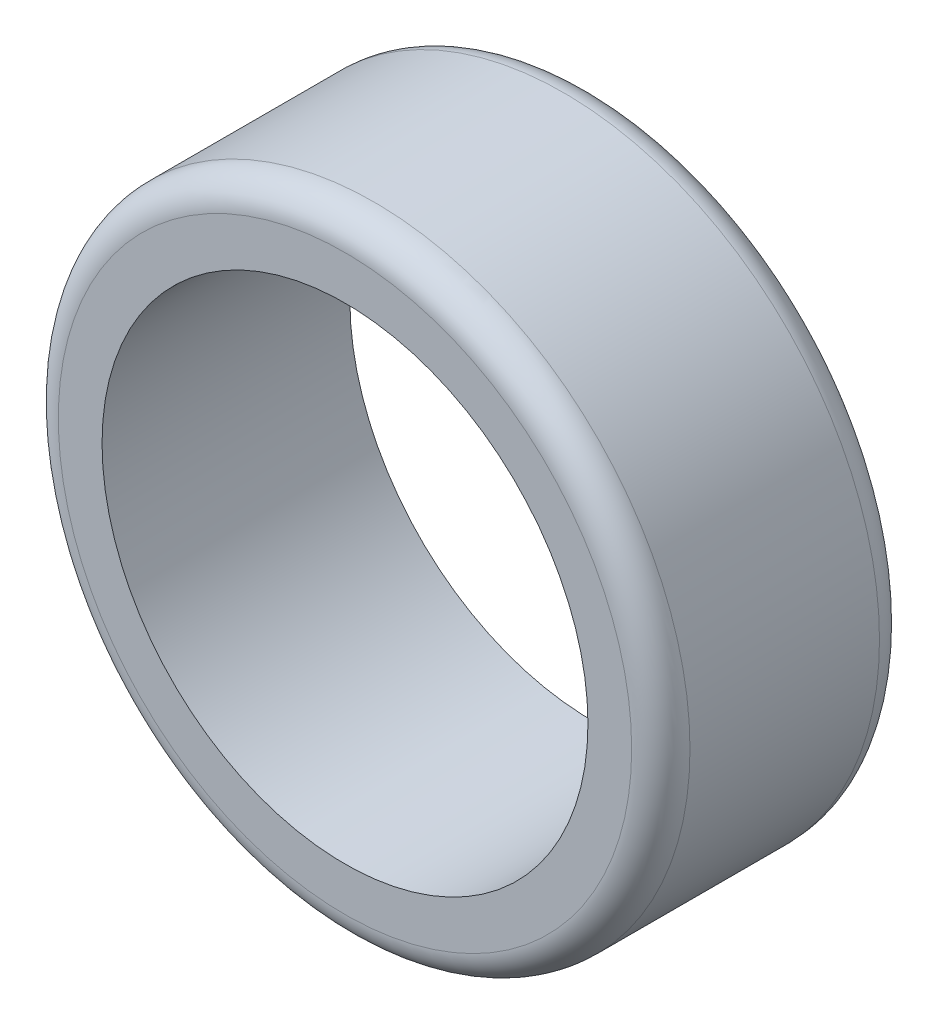
ISO-10303-21;
HEADER;
FILE_DESCRIPTION(('STEP AP214'),'2;1');
FILE_NAME('part.step','',(''),(''),'','','');
FILE_SCHEMA(('AUTOMOTIVE_DESIGN { 1 0 10303 214 1 1 1 1 }'));
ENDSEC;
DATA;
#1=APPLICATION_CONTEXT('core data for automotive mechanical design processes');
#2=APPLICATION_PROTOCOL_DEFINITION('international standard','automotive_design',2000,#1);
#3=PRODUCT_CONTEXT('',#1,'mechanical');
#4=PRODUCT('Part','Part','',(#3));
#5=PRODUCT_RELATED_PRODUCT_CATEGORY('part','',(#4));
#6=PRODUCT_DEFINITION_FORMATION('','',#4);
#7=PRODUCT_DEFINITION_CONTEXT('part definition',#1,'design');
#8=PRODUCT_DEFINITION('design','',#6,#7);
#9=PRODUCT_DEFINITION_SHAPE('','',#8);
#10=(LENGTH_UNIT() NAMED_UNIT(*) SI_UNIT(.MILLI.,.METRE.));
#11=(NAMED_UNIT(*) PLANE_ANGLE_UNIT() SI_UNIT($,.RADIAN.));
#12=(NAMED_UNIT(*) SI_UNIT($,.STERADIAN.) SOLID_ANGLE_UNIT());
#13=UNCERTAINTY_MEASURE_WITH_UNIT(LENGTH_MEASURE(1.E-05),#10,'distance_accuracy_value','');
#14=(GEOMETRIC_REPRESENTATION_CONTEXT(3) GLOBAL_UNCERTAINTY_ASSIGNED_CONTEXT((#13)) GLOBAL_UNIT_ASSIGNED_CONTEXT((#10,
#11,#12)) REPRESENTATION_CONTEXT('',''));
#15=CARTESIAN_POINT('',(0.,0.,0.));
#16=DIRECTION('',(0.,0.,1.));
#17=DIRECTION('',(1.,0.,0.));
#18=AXIS2_PLACEMENT_3D('',#15,#16,#17);
#19=CARTESIAN_POINT('',(0.,0.,25.5));
#20=DIRECTION('',(0.,0.,-1.));
#21=DIRECTION('',(-1.,0.,0.));
#22=AXIS2_PLACEMENT_3D('',#19,#20,#21);
#23=CYLINDRICAL_SURFACE('',#22,32.5);
#24=CARTESIAN_POINT('',(0.,0.,3.));
#25=DIRECTION('',(0.,0.,1.));
#26=DIRECTION('',(1.,0.,0.));
#27=AXIS2_PLACEMENT_3D('',#24,#25,#26);
#28=CIRCLE('',#27,32.5);
#29=CARTESIAN_POINT('',(32.5,0.,3.));
#30=VERTEX_POINT('',#29);
#31=EDGE_CURVE('E51',#30,#30,#28,.T.);
#32=ORIENTED_EDGE('',*,*,#31,.T.);
#33=EDGE_LOOP('',(#32));
#34=FACE_BOUND('',#33,.T.);
#35=CARTESIAN_POINT('',(0.,0.,22.5));
#36=DIRECTION('',(0.,0.,1.));
#37=DIRECTION('',(1.,0.,0.));
#38=AXIS2_PLACEMENT_3D('',#35,#36,#37);
#39=CIRCLE('',#38,32.5);
#40=CARTESIAN_POINT('',(32.5,0.,22.5));
#41=VERTEX_POINT('',#40);
#42=EDGE_CURVE('E55',#41,#41,#39,.F.);
#43=ORIENTED_EDGE('',*,*,#42,.T.);
#44=EDGE_LOOP('',(#43));
#45=FACE_BOUND('',#44,.T.);
#46=ADVANCED_FACE('F44',(#34,#45),#23,.T.);
#47=CARTESIAN_POINT('',(0.,0.,25.5));
#48=DIRECTION('',(0.,0.,1.));
#49=DIRECTION('',(1.,0.,0.));
#50=AXIS2_PLACEMENT_3D('',#47,#48,#49);
#51=PLANE('',#50);
#52=CARTESIAN_POINT('',(0.,0.,25.5));
#53=DIRECTION('',(0.,0.,1.));
#54=DIRECTION('',(1.,0.,0.));
#55=AXIS2_PLACEMENT_3D('',#52,#53,#54);
#56=CIRCLE('',#55,29.5);
#57=CARTESIAN_POINT('',(29.5,0.,25.5));
#58=VERTEX_POINT('',#57);
#59=EDGE_CURVE('E59',#58,#58,#56,.T.);
#60=ORIENTED_EDGE('',*,*,#59,.T.);
#61=EDGE_LOOP('',(#60));
#62=FACE_BOUND('',#61,.T.);
#63=CARTESIAN_POINT('',(0.,0.,25.5));
#64=DIRECTION('',(0.,0.,1.));
#65=DIRECTION('',(1.,0.,0.));
#66=AXIS2_PLACEMENT_3D('',#63,#64,#65);
#67=CIRCLE('',#66,25.);
#68=CARTESIAN_POINT('',(25.,0.,25.5));
#69=VERTEX_POINT('',#68);
#70=EDGE_CURVE('E64',#69,#69,#67,.T.);
#71=ORIENTED_EDGE('',*,*,#70,.F.);
#72=EDGE_LOOP('',(#71));
#73=FACE_BOUND('',#72,.T.);
#74=ADVANCED_FACE('F83',(#62,#73),#51,.T.);
#75=CARTESIAN_POINT('',(0.,0.,0.));
#76=DIRECTION('',(0.,0.,1.));
#77=DIRECTION('',(1.,0.,0.));
#78=AXIS2_PLACEMENT_3D('',#75,#76,#77);
#79=PLANE('',#78);
#80=CARTESIAN_POINT('',(0.,0.,0.));
#81=DIRECTION('',(0.,0.,1.));
#82=DIRECTION('',(1.,0.,0.));
#83=AXIS2_PLACEMENT_3D('',#80,#81,#82);
#84=CIRCLE('',#83,29.5);
#85=CARTESIAN_POINT('',(29.5,0.,0.));
#86=VERTEX_POINT('',#85);
#87=EDGE_CURVE('E12',#86,#86,#84,.F.);
#88=ORIENTED_EDGE('',*,*,#87,.T.);
#89=EDGE_LOOP('',(#88));
#90=FACE_BOUND('',#89,.T.);
#91=CARTESIAN_POINT('',(0.,0.,0.));
#92=DIRECTION('',(0.,0.,1.));
#93=DIRECTION('',(1.,0.,0.));
#94=AXIS2_PLACEMENT_3D('',#91,#92,#93);
#95=CIRCLE('',#94,25.);
#96=CARTESIAN_POINT('',(25.,0.,0.));
#97=VERTEX_POINT('',#96);
#98=EDGE_CURVE('E67',#97,#97,#95,.T.);
#99=ORIENTED_EDGE('',*,*,#98,.T.);
#100=EDGE_LOOP('',(#99));
#101=FACE_BOUND('',#100,.T.);
#102=ADVANCED_FACE('F71',(#90,#101),#79,.F.);
#103=CARTESIAN_POINT('',(0.,0.,0.));
#104=DIRECTION('',(0.,0.,1.));
#105=DIRECTION('',(1.,0.,0.));
#106=AXIS2_PLACEMENT_3D('',#103,#104,#105);
#107=CYLINDRICAL_SURFACE('',#106,25.);
#108=ORIENTED_EDGE('',*,*,#70,.T.);
#109=EDGE_LOOP('',(#108));
#110=FACE_BOUND('',#109,.T.);
#111=ORIENTED_EDGE('',*,*,#98,.F.);
#112=EDGE_LOOP('',(#111));
#113=FACE_BOUND('',#112,.T.);
#114=ADVANCED_FACE('F73',(#110,#113),#107,.F.);
#115=CARTESIAN_POINT('',(0.,0.,22.5));
#116=DIRECTION('',(0.,0.,1.));
#117=DIRECTION('',(1.,0.,0.));
#118=AXIS2_PLACEMENT_3D('',#115,#116,#117);
#119=TOROIDAL_SURFACE('',#118,29.5,3.);
#120=ORIENTED_EDGE('',*,*,#42,.F.);
#121=EDGE_LOOP('',(#120));
#122=FACE_BOUND('',#121,.T.);
#123=ORIENTED_EDGE('',*,*,#59,.F.);
#124=EDGE_LOOP('',(#123));
#125=FACE_BOUND('',#124,.T.);
#126=ADVANCED_FACE('F75',(#122,#125),#119,.T.);
#127=CARTESIAN_POINT('',(0.,0.,3.));
#128=DIRECTION('',(0.,0.,1.));
#129=DIRECTION('',(1.,0.,0.));
#130=AXIS2_PLACEMENT_3D('',#127,#128,#129);
#131=TOROIDAL_SURFACE('',#130,29.5,3.);
#132=ORIENTED_EDGE('',*,*,#87,.F.);
#133=EDGE_LOOP('',(#132));
#134=FACE_BOUND('',#133,.T.);
#135=ORIENTED_EDGE('',*,*,#31,.F.);
#136=EDGE_LOOP('',(#135));
#137=FACE_BOUND('',#136,.T.);
#138=ADVANCED_FACE('F46',(#134,#137),#131,.T.);
#139=CLOSED_SHELL('',(#46,#74,#102,#114,#126,#138));
#140=MANIFOLD_SOLID_BREP('B2',#139);
#141=ADVANCED_BREP_SHAPE_REPRESENTATION('',(#18,#140),#14);
#142=SHAPE_DEFINITION_REPRESENTATION(#9,#141);
ENDSEC;
END-ISO-10303-21;
